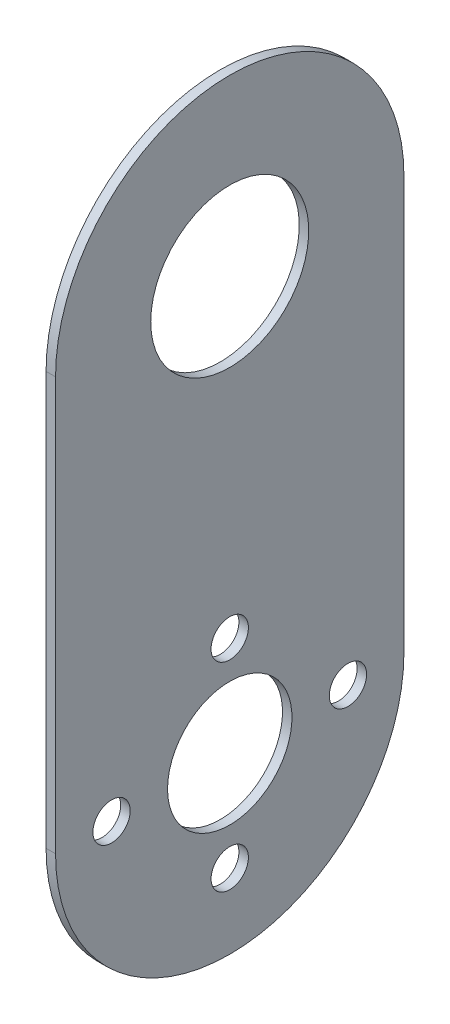
ISO-10303-21;
HEADER;
FILE_DESCRIPTION(('STEP AP214'),'2;1');
FILE_NAME('part.step','',(''),(''),'','','');
FILE_SCHEMA(('AUTOMOTIVE_DESIGN { 1 0 10303 214 1 1 1 1 }'));
ENDSEC;
DATA;
#1=APPLICATION_CONTEXT('core data for automotive mechanical design processes');
#2=APPLICATION_PROTOCOL_DEFINITION('international standard','automotive_design',2000,#1);
#3=PRODUCT_CONTEXT('',#1,'mechanical');
#4=PRODUCT('Part','Part','',(#3));
#5=PRODUCT_RELATED_PRODUCT_CATEGORY('part','',(#4));
#6=PRODUCT_DEFINITION_FORMATION('','',#4);
#7=PRODUCT_DEFINITION_CONTEXT('part definition',#1,'design');
#8=PRODUCT_DEFINITION('design','',#6,#7);
#9=PRODUCT_DEFINITION_SHAPE('','',#8);
#10=(LENGTH_UNIT() NAMED_UNIT(*) SI_UNIT(.MILLI.,.METRE.));
#11=(NAMED_UNIT(*) PLANE_ANGLE_UNIT() SI_UNIT($,.RADIAN.));
#12=(NAMED_UNIT(*) SI_UNIT($,.STERADIAN.) SOLID_ANGLE_UNIT());
#13=UNCERTAINTY_MEASURE_WITH_UNIT(LENGTH_MEASURE(1.E-05),#10,'distance_accuracy_value','');
#14=(GEOMETRIC_REPRESENTATION_CONTEXT(3) GLOBAL_UNCERTAINTY_ASSIGNED_CONTEXT((#13)) GLOBAL_UNIT_ASSIGNED_CONTEXT((#10,
#11,#12)) REPRESENTATION_CONTEXT('',''));
#15=CARTESIAN_POINT('',(0.,0.,0.));
#16=DIRECTION('',(0.,0.,1.));
#17=DIRECTION('',(1.,0.,0.));
#18=AXIS2_PLACEMENT_3D('',#15,#16,#17);
#19=CARTESIAN_POINT('',(0.762,0.,-14.00048));
#20=DIRECTION('',(0.,0.,-1.));
#21=DIRECTION('',(0.,1.,0.));
#22=AXIS2_PLACEMENT_3D('',#19,#20,#21);
#23=PLANE('',#22);
#24=DIRECTION('',(0.,-1.,0.));
#25=VECTOR('',#24,1.);
#26=CARTESIAN_POINT('',(0.,0.,-14.00048));
#27=LINE('',#26,#25);
#28=CARTESIAN_POINT('',(0.,0.,-14.00048));
#29=VERTEX_POINT('',#28);
#30=CARTESIAN_POINT('',(0.,-33.1978,-14.00048));
#31=VERTEX_POINT('',#30);
#32=EDGE_CURVE('E106',#29,#31,#27,.T.);
#33=ORIENTED_EDGE('',*,*,#32,.F.);
#34=DIRECTION('',(-1.,0.,0.));
#35=VECTOR('',#34,1.);
#36=CARTESIAN_POINT('',(0.762,0.,-14.00048));
#37=LINE('',#36,#35);
#38=CARTESIAN_POINT('',(0.762,0.,-14.00048));
#39=VERTEX_POINT('',#38);
#40=EDGE_CURVE('E11',#39,#29,#37,.T.);
#41=ORIENTED_EDGE('',*,*,#40,.F.);
#42=DIRECTION('',(0.,-1.,0.));
#43=VECTOR('',#42,1.);
#44=CARTESIAN_POINT('',(0.762,0.,-14.00048));
#45=LINE('',#44,#43);
#46=CARTESIAN_POINT('',(0.762,-33.1978,-14.00048));
#47=VERTEX_POINT('',#46);
#48=EDGE_CURVE('E92',#39,#47,#45,.T.);
#49=ORIENTED_EDGE('',*,*,#48,.T.);
#50=DIRECTION('',(-1.,0.,0.));
#51=VECTOR('',#50,1.);
#52=CARTESIAN_POINT('',(0.762,-33.1978,-14.00048));
#53=LINE('',#52,#51);
#54=EDGE_CURVE('E74',#47,#31,#53,.T.);
#55=ORIENTED_EDGE('',*,*,#54,.T.);
#56=EDGE_LOOP('',(#33,#41,#49,#55));
#57=FACE_BOUND('',#56,.T.);
#58=ADVANCED_FACE('F35',(#57),#23,.T.);
#59=CARTESIAN_POINT('',(0.762,0.,0.));
#60=DIRECTION('',(-1.,0.,0.));
#61=DIRECTION('',(0.,0.,1.));
#62=AXIS2_PLACEMENT_3D('',#59,#60,#61);
#63=CYLINDRICAL_SURFACE('',#62,14.00048);
#64=CARTESIAN_POINT('',(0.,0.,0.));
#65=DIRECTION('',(1.,0.,0.));
#66=DIRECTION('',(0.,0.,-1.));
#67=AXIS2_PLACEMENT_3D('',#64,#65,#66);
#68=CIRCLE('',#67,14.00048);
#69=CARTESIAN_POINT('',(0.,0.,14.00048));
#70=VERTEX_POINT('',#69);
#71=EDGE_CURVE('E97',#29,#70,#68,.T.);
#72=ORIENTED_EDGE('',*,*,#71,.T.);
#73=DIRECTION('',(-1.,0.,0.));
#74=VECTOR('',#73,1.);
#75=CARTESIAN_POINT('',(0.762,0.,14.00048));
#76=LINE('',#75,#74);
#77=CARTESIAN_POINT('',(0.762,0.,14.00048));
#78=VERTEX_POINT('',#77);
#79=EDGE_CURVE('E44',#78,#70,#76,.T.);
#80=ORIENTED_EDGE('',*,*,#79,.F.);
#81=CARTESIAN_POINT('',(0.762,0.,0.));
#82=DIRECTION('',(1.,0.,0.));
#83=DIRECTION('',(0.,0.,-1.));
#84=AXIS2_PLACEMENT_3D('',#81,#82,#83);
#85=CIRCLE('',#84,14.00048);
#86=EDGE_CURVE('E89',#39,#78,#85,.T.);
#87=ORIENTED_EDGE('',*,*,#86,.F.);
#88=ORIENTED_EDGE('',*,*,#40,.T.);
#89=EDGE_LOOP('',(#72,#80,#87,#88));
#90=FACE_BOUND('',#89,.T.);
#91=ADVANCED_FACE('F95',(#90),#63,.T.);
#92=CARTESIAN_POINT('',(0.762,0.,14.00048));
#93=DIRECTION('',(0.,0.,-1.));
#94=DIRECTION('',(0.,1.,0.));
#95=AXIS2_PLACEMENT_3D('',#92,#93,#94);
#96=PLANE('',#95);
#97=DIRECTION('',(0.,-1.,0.));
#98=VECTOR('',#97,1.);
#99=CARTESIAN_POINT('',(0.,0.,14.00048));
#100=LINE('',#99,#98);
#101=CARTESIAN_POINT('',(0.,-33.1978,14.00048));
#102=VERTEX_POINT('',#101);
#103=EDGE_CURVE('E103',#70,#102,#100,.T.);
#104=ORIENTED_EDGE('',*,*,#103,.T.);
#105=DIRECTION('',(-1.,0.,0.));
#106=VECTOR('',#105,1.);
#107=CARTESIAN_POINT('',(0.762,-33.1978,14.00048));
#108=LINE('',#107,#106);
#109=CARTESIAN_POINT('',(0.762,-33.1978,14.00048));
#110=VERTEX_POINT('',#109);
#111=EDGE_CURVE('E88',#110,#102,#108,.T.);
#112=ORIENTED_EDGE('',*,*,#111,.F.);
#113=DIRECTION('',(0.,-1.,0.));
#114=VECTOR('',#113,1.);
#115=CARTESIAN_POINT('',(0.762,0.,14.00048));
#116=LINE('',#115,#114);
#117=EDGE_CURVE('E82',#78,#110,#116,.T.);
#118=ORIENTED_EDGE('',*,*,#117,.F.);
#119=ORIENTED_EDGE('',*,*,#79,.T.);
#120=EDGE_LOOP('',(#104,#112,#118,#119));
#121=FACE_BOUND('',#120,.T.);
#122=ADVANCED_FACE('F85',(#121),#96,.F.);
#123=CARTESIAN_POINT('',(0.762,0.,0.));
#124=DIRECTION('',(-1.,0.,0.));
#125=DIRECTION('',(0.,0.,1.));
#126=AXIS2_PLACEMENT_3D('',#123,#124,#125);
#127=CYLINDRICAL_SURFACE('',#126,6.35);
#128=CARTESIAN_POINT('',(0.762,0.,0.));
#129=DIRECTION('',(1.,0.,0.));
#130=DIRECTION('',(0.,0.,-1.));
#131=AXIS2_PLACEMENT_3D('',#128,#129,#130);
#132=CIRCLE('',#131,6.35);
#133=CARTESIAN_POINT('',(0.762,0.,6.35));
#134=VERTEX_POINT('',#133);
#135=EDGE_CURVE('E128',#134,#134,#132,.T.);
#136=CARTESIAN_POINT('',(0.,0.,0.));
#137=DIRECTION('',(1.,0.,0.));
#138=DIRECTION('',(0.,0.,-1.));
#139=AXIS2_PLACEMENT_3D('',#136,#137,#138);
#140=CIRCLE('',#139,6.35);
#141=CARTESIAN_POINT('',(0.,0.,6.35));
#142=VERTEX_POINT('',#141);
#143=EDGE_CURVE('E108',#142,#142,#140,.T.);
#144=CARTESIAN_POINT('',(0.762,0.,6.35));
#145=CARTESIAN_POINT('',(0.7540625,0.,6.35));
#146=CARTESIAN_POINT('',(0.746125,0.,6.35));
#147=CARTESIAN_POINT('',(0.73025,0.,6.35));
#148=CARTESIAN_POINT('',(0.7223125,0.,6.35));
#149=CARTESIAN_POINT('',(0.7064375,0.,6.35));
#150=CARTESIAN_POINT('',(0.6985,0.,6.35));
#151=CARTESIAN_POINT('',(0.682625,0.,6.35));
#152=CARTESIAN_POINT('',(0.6746875,0.,6.35));
#153=CARTESIAN_POINT('',(0.6588125,0.,6.35));
#154=CARTESIAN_POINT('',(0.650875,0.,6.35));
#155=CARTESIAN_POINT('',(0.635,0.,6.35));
#156=CARTESIAN_POINT('',(0.6270625,0.,6.35));
#157=CARTESIAN_POINT('',(0.6111875,0.,6.35));
#158=CARTESIAN_POINT('',(0.60325,0.,6.35));
#159=CARTESIAN_POINT('',(0.587375,0.,6.35));
#160=CARTESIAN_POINT('',(0.5794375,0.,6.35));
#161=CARTESIAN_POINT('',(0.5635625,0.,6.35));
#162=CARTESIAN_POINT('',(0.555625,0.,6.35));
#163=CARTESIAN_POINT('',(0.53975,0.,6.35));
#164=CARTESIAN_POINT('',(0.5318125,0.,6.35));
#165=CARTESIAN_POINT('',(0.5159375,0.,6.35));
#166=CARTESIAN_POINT('',(0.508,0.,6.35));
#167=CARTESIAN_POINT('',(0.492125,0.,6.35));
#168=CARTESIAN_POINT('',(0.4841875,0.,6.35));
#169=CARTESIAN_POINT('',(0.4683125,0.,6.35));
#170=CARTESIAN_POINT('',(0.460375,0.,6.35));
#171=CARTESIAN_POINT('',(0.4445,0.,6.35));
#172=CARTESIAN_POINT('',(0.4365625,0.,6.35));
#173=CARTESIAN_POINT('',(0.4206875,0.,6.35));
#174=CARTESIAN_POINT('',(0.41275,0.,6.35));
#175=CARTESIAN_POINT('',(0.396875,0.,6.35));
#176=CARTESIAN_POINT('',(0.3889375,0.,6.35));
#177=CARTESIAN_POINT('',(0.3730625,0.,6.35));
#178=CARTESIAN_POINT('',(0.365125,0.,6.35));
#179=CARTESIAN_POINT('',(0.34925,0.,6.35));
#180=CARTESIAN_POINT('',(0.3413125,0.,6.35));
#181=CARTESIAN_POINT('',(0.3254375,0.,6.35));
#182=CARTESIAN_POINT('',(0.3175,0.,6.35));
#183=CARTESIAN_POINT('',(0.301625,0.,6.35));
#184=CARTESIAN_POINT('',(0.2936875,0.,6.35));
#185=CARTESIAN_POINT('',(0.2778125,0.,6.35));
#186=CARTESIAN_POINT('',(0.269875,0.,6.35));
#187=CARTESIAN_POINT('',(0.254,0.,6.35));
#188=CARTESIAN_POINT('',(0.2460625,0.,6.35));
#189=CARTESIAN_POINT('',(0.2301875,0.,6.35));
#190=CARTESIAN_POINT('',(0.22225,0.,6.35));
#191=CARTESIAN_POINT('',(0.206375,0.,6.35));
#192=CARTESIAN_POINT('',(0.1984375,0.,6.35));
#193=CARTESIAN_POINT('',(0.1825625,0.,6.35));
#194=CARTESIAN_POINT('',(0.174625,0.,6.35));
#195=CARTESIAN_POINT('',(0.15875,0.,6.35));
#196=CARTESIAN_POINT('',(0.1508125,0.,6.35));
#197=CARTESIAN_POINT('',(0.1349375,0.,6.35));
#198=CARTESIAN_POINT('',(0.127,0.,6.35));
#199=CARTESIAN_POINT('',(0.111125,0.,6.35));
#200=CARTESIAN_POINT('',(0.1031875,0.,6.35));
#201=CARTESIAN_POINT('',(0.0873125,0.,6.35));
#202=CARTESIAN_POINT('',(0.079375,0.,6.35));
#203=CARTESIAN_POINT('',(0.0635,0.,6.35));
#204=CARTESIAN_POINT('',(0.0555625,0.,6.35));
#205=CARTESIAN_POINT('',(0.0396875,0.,6.35));
#206=CARTESIAN_POINT('',(0.03175,0.,6.35));
#207=CARTESIAN_POINT('',(0.015875,0.,6.35));
#208=CARTESIAN_POINT('',(0.00793749999999999,0.,6.35));
#209=CARTESIAN_POINT('',(0.,0.,6.35));
#210=B_SPLINE_CURVE_WITH_KNOTS('',3,(#144,#145,#146,#147,#148,#149,#150,#151,#152,#153,#154,
#155,#156,#157,#158,#159,#160,#161,#162,#163,#164,#165,#166,#167,#168,#169,#170,#171,#172,#173,
#174,#175,#176,#177,#178,#179,#180,#181,#182,#183,#184,#185,#186,#187,#188,#189,#190,#191,#192,
#193,#194,#195,#196,#197,#198,#199,#200,#201,#202,#203,#204,#205,#206,#207,#208,#209),
.UNSPECIFIED.,.F.,.F.,(4,2,2,2,2,2,2,2,2,2,2,2,2,2,2,2,2,2,2,2,2,2,2,2,2,2,2,2,2,2,2,2,4),(0.,
0.0238125000000001,0.047625,0.0714375,0.0952500000000001,0.1190625,0.142875,0.1666875,0.1905,
0.2143125,0.238125,0.2619375,0.28575,0.3095625,0.333375,0.3571875,0.381,0.4048125,0.428625,
0.4524375,0.47625,0.5000625,0.523875,0.5476875,0.5715,0.5953125,0.619125,0.6429375,0.66675,
0.6905625,0.714375,0.7381875,0.762),.UNSPECIFIED.);
#211=EDGE_CURVE('BSEAM163',#134,#142,#210,.T.);
#212=ORIENTED_EDGE('',*,*,#135,.T.);
#213=ORIENTED_EDGE('',*,*,#143,.F.);
#214=ORIENTED_EDGE('',*,*,#211,.T.);
#215=ORIENTED_EDGE('',*,*,#211,.F.);
#216=EDGE_LOOP('',(#212,#214,#213,#215));
#217=FACE_BOUND('',#216,.T.);
#218=ADVANCED_FACE('F163',(#217),#127,.F.);
#219=CARTESIAN_POINT('',(0.762,-25.1978,0.));
#220=DIRECTION('',(-1.,0.,0.));
#221=DIRECTION('',(0.,0.,1.));
#222=AXIS2_PLACEMENT_3D('',#219,#220,#221);
#223=CYLINDRICAL_SURFACE('',#222,1.5);
#224=CARTESIAN_POINT('',(0.762,-25.1978,0.));
#225=DIRECTION('',(1.,0.,0.));
#226=DIRECTION('',(0.,0.,-1.));
#227=AXIS2_PLACEMENT_3D('',#224,#225,#226);
#228=CIRCLE('',#227,1.5);
#229=CARTESIAN_POINT('',(0.762,-25.1978,1.5));
#230=VERTEX_POINT('',#229);
#231=EDGE_CURVE('E131',#230,#230,#228,.T.);
#232=CARTESIAN_POINT('',(0.,-25.1978,0.));
#233=DIRECTION('',(1.,0.,0.));
#234=DIRECTION('',(0.,0.,-1.));
#235=AXIS2_PLACEMENT_3D('',#232,#233,#234);
#236=CIRCLE('',#235,1.5);
#237=CARTESIAN_POINT('',(0.,-25.1978,1.5));
#238=VERTEX_POINT('',#237);
#239=EDGE_CURVE('E111',#238,#238,#236,.T.);
#240=CARTESIAN_POINT('',(0.762,-25.1978,1.5));
#241=CARTESIAN_POINT('',(0.7540625,-25.1978,1.5));
#242=CARTESIAN_POINT('',(0.746125,-25.1978,1.5));
#243=CARTESIAN_POINT('',(0.73025,-25.1978,1.5));
#244=CARTESIAN_POINT('',(0.7223125,-25.1978,1.5));
#245=CARTESIAN_POINT('',(0.7064375,-25.1978,1.5));
#246=CARTESIAN_POINT('',(0.6985,-25.1978,1.5));
#247=CARTESIAN_POINT('',(0.682625,-25.1978,1.5));
#248=CARTESIAN_POINT('',(0.6746875,-25.1978,1.5));
#249=CARTESIAN_POINT('',(0.6588125,-25.1978,1.5));
#250=CARTESIAN_POINT('',(0.650875,-25.1978,1.5));
#251=CARTESIAN_POINT('',(0.635,-25.1978,1.5));
#252=CARTESIAN_POINT('',(0.6270625,-25.1978,1.5));
#253=CARTESIAN_POINT('',(0.6111875,-25.1978,1.5));
#254=CARTESIAN_POINT('',(0.60325,-25.1978,1.5));
#255=CARTESIAN_POINT('',(0.587375,-25.1978,1.5));
#256=CARTESIAN_POINT('',(0.5794375,-25.1978,1.5));
#257=CARTESIAN_POINT('',(0.5635625,-25.1978,1.5));
#258=CARTESIAN_POINT('',(0.555625,-25.1978,1.5));
#259=CARTESIAN_POINT('',(0.53975,-25.1978,1.5));
#260=CARTESIAN_POINT('',(0.5318125,-25.1978,1.5));
#261=CARTESIAN_POINT('',(0.5159375,-25.1978,1.5));
#262=CARTESIAN_POINT('',(0.508,-25.1978,1.5));
#263=CARTESIAN_POINT('',(0.492125,-25.1978,1.5));
#264=CARTESIAN_POINT('',(0.4841875,-25.1978,1.5));
#265=CARTESIAN_POINT('',(0.4683125,-25.1978,1.5));
#266=CARTESIAN_POINT('',(0.460375,-25.1978,1.5));
#267=CARTESIAN_POINT('',(0.4445,-25.1978,1.5));
#268=CARTESIAN_POINT('',(0.4365625,-25.1978,1.5));
#269=CARTESIAN_POINT('',(0.4206875,-25.1978,1.5));
#270=CARTESIAN_POINT('',(0.41275,-25.1978,1.5));
#271=CARTESIAN_POINT('',(0.396875,-25.1978,1.5));
#272=CARTESIAN_POINT('',(0.3889375,-25.1978,1.5));
#273=CARTESIAN_POINT('',(0.3730625,-25.1978,1.5));
#274=CARTESIAN_POINT('',(0.365125,-25.1978,1.5));
#275=CARTESIAN_POINT('',(0.34925,-25.1978,1.5));
#276=CARTESIAN_POINT('',(0.3413125,-25.1978,1.5));
#277=CARTESIAN_POINT('',(0.3254375,-25.1978,1.5));
#278=CARTESIAN_POINT('',(0.3175,-25.1978,1.5));
#279=CARTESIAN_POINT('',(0.301625,-25.1978,1.5));
#280=CARTESIAN_POINT('',(0.2936875,-25.1978,1.5));
#281=CARTESIAN_POINT('',(0.2778125,-25.1978,1.5));
#282=CARTESIAN_POINT('',(0.269875,-25.1978,1.5));
#283=CARTESIAN_POINT('',(0.254,-25.1978,1.5));
#284=CARTESIAN_POINT('',(0.2460625,-25.1978,1.5));
#285=CARTESIAN_POINT('',(0.2301875,-25.1978,1.5));
#286=CARTESIAN_POINT('',(0.22225,-25.1978,1.5));
#287=CARTESIAN_POINT('',(0.206375,-25.1978,1.5));
#288=CARTESIAN_POINT('',(0.1984375,-25.1978,1.5));
#289=CARTESIAN_POINT('',(0.1825625,-25.1978,1.5));
#290=CARTESIAN_POINT('',(0.174625,-25.1978,1.5));
#291=CARTESIAN_POINT('',(0.15875,-25.1978,1.5));
#292=CARTESIAN_POINT('',(0.1508125,-25.1978,1.5));
#293=CARTESIAN_POINT('',(0.1349375,-25.1978,1.5));
#294=CARTESIAN_POINT('',(0.127,-25.1978,1.5));
#295=CARTESIAN_POINT('',(0.111125,-25.1978,1.5));
#296=CARTESIAN_POINT('',(0.1031875,-25.1978,1.5));
#297=CARTESIAN_POINT('',(0.0873125,-25.1978,1.5));
#298=CARTESIAN_POINT('',(0.079375,-25.1978,1.5));
#299=CARTESIAN_POINT('',(0.0635,-25.1978,1.5));
#300=CARTESIAN_POINT('',(0.0555625,-25.1978,1.5));
#301=CARTESIAN_POINT('',(0.0396875,-25.1978,1.5));
#302=CARTESIAN_POINT('',(0.03175,-25.1978,1.5));
#303=CARTESIAN_POINT('',(0.015875,-25.1978,1.5));
#304=CARTESIAN_POINT('',(0.00793749999999999,-25.1978,1.5));
#305=CARTESIAN_POINT('',(0.,-25.1978,1.5));
#306=B_SPLINE_CURVE_WITH_KNOTS('',3,(#240,#241,#242,#243,#244,#245,#246,#247,#248,#249,#250,
#251,#252,#253,#254,#255,#256,#257,#258,#259,#260,#261,#262,#263,#264,#265,#266,#267,#268,#269,
#270,#271,#272,#273,#274,#275,#276,#277,#278,#279,#280,#281,#282,#283,#284,#285,#286,#287,#288,
#289,#290,#291,#292,#293,#294,#295,#296,#297,#298,#299,#300,#301,#302,#303,#304,#305),
.UNSPECIFIED.,.F.,.F.,(4,2,2,2,2,2,2,2,2,2,2,2,2,2,2,2,2,2,2,2,2,2,2,2,2,2,2,2,2,2,2,2,4),(0.,
0.0238125000000001,0.047625,0.0714375,0.0952500000000001,0.1190625,0.142875,0.1666875,0.1905,
0.2143125,0.238125,0.2619375,0.28575,0.3095625,0.333375,0.3571875,0.381,0.4048125,0.428625,
0.4524375,0.47625,0.5000625,0.523875,0.5476875,0.5715,0.5953125,0.619125,0.6429375,0.66675,
0.6905625,0.714375,0.7381875,0.762),.UNSPECIFIED.);
#307=EDGE_CURVE('BSEAM166',#230,#238,#306,.T.);
#308=ORIENTED_EDGE('',*,*,#231,.T.);
#309=ORIENTED_EDGE('',*,*,#239,.F.);
#310=ORIENTED_EDGE('',*,*,#307,.T.);
#311=ORIENTED_EDGE('',*,*,#307,.F.);
#312=EDGE_LOOP('',(#308,#310,#309,#311));
#313=FACE_BOUND('',#312,.T.);
#314=ADVANCED_FACE('F166',(#313),#223,.F.);
#315=CARTESIAN_POINT('',(0.762,-41.1978,0.));
#316=DIRECTION('',(-1.,0.,0.));
#317=DIRECTION('',(0.,0.,1.));
#318=AXIS2_PLACEMENT_3D('',#315,#316,#317);
#319=CYLINDRICAL_SURFACE('',#318,1.5);
#320=CARTESIAN_POINT('',(0.762,-41.1978,0.));
#321=DIRECTION('',(1.,0.,0.));
#322=DIRECTION('',(0.,0.,-1.));
#323=AXIS2_PLACEMENT_3D('',#320,#321,#322);
#324=CIRCLE('',#323,1.5);
#325=CARTESIAN_POINT('',(0.762,-41.1978,1.5));
#326=VERTEX_POINT('',#325);
#327=EDGE_CURVE('E134',#326,#326,#324,.T.);
#328=CARTESIAN_POINT('',(0.,-41.1978,0.));
#329=DIRECTION('',(1.,0.,0.));
#330=DIRECTION('',(0.,0.,-1.));
#331=AXIS2_PLACEMENT_3D('',#328,#329,#330);
#332=CIRCLE('',#331,1.5);
#333=CARTESIAN_POINT('',(0.,-41.1978,1.5));
#334=VERTEX_POINT('',#333);
#335=EDGE_CURVE('E114',#334,#334,#332,.T.);
#336=CARTESIAN_POINT('',(0.762,-41.1978,1.5));
#337=CARTESIAN_POINT('',(0.7540625,-41.1978,1.5));
#338=CARTESIAN_POINT('',(0.746125,-41.1978,1.5));
#339=CARTESIAN_POINT('',(0.73025,-41.1978,1.5));
#340=CARTESIAN_POINT('',(0.7223125,-41.1978,1.5));
#341=CARTESIAN_POINT('',(0.7064375,-41.1978,1.5));
#342=CARTESIAN_POINT('',(0.6985,-41.1978,1.5));
#343=CARTESIAN_POINT('',(0.682625,-41.1978,1.5));
#344=CARTESIAN_POINT('',(0.6746875,-41.1978,1.5));
#345=CARTESIAN_POINT('',(0.6588125,-41.1978,1.5));
#346=CARTESIAN_POINT('',(0.650875,-41.1978,1.5));
#347=CARTESIAN_POINT('',(0.635,-41.1978,1.5));
#348=CARTESIAN_POINT('',(0.6270625,-41.1978,1.5));
#349=CARTESIAN_POINT('',(0.6111875,-41.1978,1.5));
#350=CARTESIAN_POINT('',(0.60325,-41.1978,1.5));
#351=CARTESIAN_POINT('',(0.587375,-41.1978,1.5));
#352=CARTESIAN_POINT('',(0.5794375,-41.1978,1.5));
#353=CARTESIAN_POINT('',(0.5635625,-41.1978,1.5));
#354=CARTESIAN_POINT('',(0.555625,-41.1978,1.5));
#355=CARTESIAN_POINT('',(0.53975,-41.1978,1.5));
#356=CARTESIAN_POINT('',(0.5318125,-41.1978,1.5));
#357=CARTESIAN_POINT('',(0.5159375,-41.1978,1.5));
#358=CARTESIAN_POINT('',(0.508,-41.1978,1.5));
#359=CARTESIAN_POINT('',(0.492125,-41.1978,1.5));
#360=CARTESIAN_POINT('',(0.4841875,-41.1978,1.5));
#361=CARTESIAN_POINT('',(0.4683125,-41.1978,1.5));
#362=CARTESIAN_POINT('',(0.460375,-41.1978,1.5));
#363=CARTESIAN_POINT('',(0.4445,-41.1978,1.5));
#364=CARTESIAN_POINT('',(0.4365625,-41.1978,1.5));
#365=CARTESIAN_POINT('',(0.4206875,-41.1978,1.5));
#366=CARTESIAN_POINT('',(0.41275,-41.1978,1.5));
#367=CARTESIAN_POINT('',(0.396875,-41.1978,1.5));
#368=CARTESIAN_POINT('',(0.3889375,-41.1978,1.5));
#369=CARTESIAN_POINT('',(0.3730625,-41.1978,1.5));
#370=CARTESIAN_POINT('',(0.365125,-41.1978,1.5));
#371=CARTESIAN_POINT('',(0.34925,-41.1978,1.5));
#372=CARTESIAN_POINT('',(0.3413125,-41.1978,1.5));
#373=CARTESIAN_POINT('',(0.3254375,-41.1978,1.5));
#374=CARTESIAN_POINT('',(0.3175,-41.1978,1.5));
#375=CARTESIAN_POINT('',(0.301625,-41.1978,1.5));
#376=CARTESIAN_POINT('',(0.2936875,-41.1978,1.5));
#377=CARTESIAN_POINT('',(0.2778125,-41.1978,1.5));
#378=CARTESIAN_POINT('',(0.269875,-41.1978,1.5));
#379=CARTESIAN_POINT('',(0.254,-41.1978,1.5));
#380=CARTESIAN_POINT('',(0.2460625,-41.1978,1.5));
#381=CARTESIAN_POINT('',(0.2301875,-41.1978,1.5));
#382=CARTESIAN_POINT('',(0.22225,-41.1978,1.5));
#383=CARTESIAN_POINT('',(0.206375,-41.1978,1.5));
#384=CARTESIAN_POINT('',(0.1984375,-41.1978,1.5));
#385=CARTESIAN_POINT('',(0.1825625,-41.1978,1.5));
#386=CARTESIAN_POINT('',(0.174625,-41.1978,1.5));
#387=CARTESIAN_POINT('',(0.15875,-41.1978,1.5));
#388=CARTESIAN_POINT('',(0.1508125,-41.1978,1.5));
#389=CARTESIAN_POINT('',(0.1349375,-41.1978,1.5));
#390=CARTESIAN_POINT('',(0.127,-41.1978,1.5));
#391=CARTESIAN_POINT('',(0.111125,-41.1978,1.5));
#392=CARTESIAN_POINT('',(0.1031875,-41.1978,1.5));
#393=CARTESIAN_POINT('',(0.0873125,-41.1978,1.5));
#394=CARTESIAN_POINT('',(0.079375,-41.1978,1.5));
#395=CARTESIAN_POINT('',(0.0635,-41.1978,1.5));
#396=CARTESIAN_POINT('',(0.0555625,-41.1978,1.5));
#397=CARTESIAN_POINT('',(0.0396875,-41.1978,1.5));
#398=CARTESIAN_POINT('',(0.03175,-41.1978,1.5));
#399=CARTESIAN_POINT('',(0.015875,-41.1978,1.5));
#400=CARTESIAN_POINT('',(0.00793749999999999,-41.1978,1.5));
#401=CARTESIAN_POINT('',(0.,-41.1978,1.5));
#402=B_SPLINE_CURVE_WITH_KNOTS('',3,(#336,#337,#338,#339,#340,#341,#342,#343,#344,#345,#346,
#347,#348,#349,#350,#351,#352,#353,#354,#355,#356,#357,#358,#359,#360,#361,#362,#363,#364,#365,
#366,#367,#368,#369,#370,#371,#372,#373,#374,#375,#376,#377,#378,#379,#380,#381,#382,#383,#384,
#385,#386,#387,#388,#389,#390,#391,#392,#393,#394,#395,#396,#397,#398,#399,#400,#401),
.UNSPECIFIED.,.F.,.F.,(4,2,2,2,2,2,2,2,2,2,2,2,2,2,2,2,2,2,2,2,2,2,2,2,2,2,2,2,2,2,2,2,4),(0.,
0.0238125000000001,0.047625,0.0714375,0.0952500000000001,0.1190625,0.142875,0.1666875,0.1905,
0.2143125,0.238125,0.2619375,0.28575,0.3095625,0.333375,0.3571875,0.381,0.4048125,0.428625,
0.4524375,0.47625,0.5000625,0.523875,0.5476875,0.5715,0.5953125,0.619125,0.6429375,0.66675,
0.6905625,0.714375,0.7381875,0.762),.UNSPECIFIED.);
#403=EDGE_CURVE('BSEAM183',#326,#334,#402,.T.);
#404=ORIENTED_EDGE('',*,*,#327,.T.);
#405=ORIENTED_EDGE('',*,*,#335,.F.);
#406=ORIENTED_EDGE('',*,*,#403,.T.);
#407=ORIENTED_EDGE('',*,*,#403,.F.);
#408=EDGE_LOOP('',(#404,#406,#405,#407));
#409=FACE_BOUND('',#408,.T.);
#410=ADVANCED_FACE('F183',(#409),#319,.F.);
#411=CARTESIAN_POINT('',(0.762,-33.1978,9.5));
#412=DIRECTION('',(-1.,0.,0.));
#413=DIRECTION('',(0.,0.,1.));
#414=AXIS2_PLACEMENT_3D('',#411,#412,#413);
#415=CYLINDRICAL_SURFACE('',#414,1.5);
#416=CARTESIAN_POINT('',(0.762,-33.1978,9.5));
#417=DIRECTION('',(1.,0.,0.));
#418=DIRECTION('',(0.,0.,-1.));
#419=AXIS2_PLACEMENT_3D('',#416,#417,#418);
#420=CIRCLE('',#419,1.5);
#421=CARTESIAN_POINT('',(0.762,-33.1978,11.));
#422=VERTEX_POINT('',#421);
#423=EDGE_CURVE('E137',#422,#422,#420,.T.);
#424=CARTESIAN_POINT('',(0.,-33.1978,9.5));
#425=DIRECTION('',(1.,0.,0.));
#426=DIRECTION('',(0.,0.,-1.));
#427=AXIS2_PLACEMENT_3D('',#424,#425,#426);
#428=CIRCLE('',#427,1.5);
#429=CARTESIAN_POINT('',(0.,-33.1978,11.));
#430=VERTEX_POINT('',#429);
#431=EDGE_CURVE('E117',#430,#430,#428,.T.);
#432=CARTESIAN_POINT('',(0.762,-33.1978,11.));
#433=CARTESIAN_POINT('',(0.7540625,-33.1978,11.));
#434=CARTESIAN_POINT('',(0.746125,-33.1978,11.));
#435=CARTESIAN_POINT('',(0.73025,-33.1978,11.));
#436=CARTESIAN_POINT('',(0.7223125,-33.1978,11.));
#437=CARTESIAN_POINT('',(0.7064375,-33.1978,11.));
#438=CARTESIAN_POINT('',(0.6985,-33.1978,11.));
#439=CARTESIAN_POINT('',(0.682625,-33.1978,11.));
#440=CARTESIAN_POINT('',(0.6746875,-33.1978,11.));
#441=CARTESIAN_POINT('',(0.6588125,-33.1978,11.));
#442=CARTESIAN_POINT('',(0.650875,-33.1978,11.));
#443=CARTESIAN_POINT('',(0.635,-33.1978,11.));
#444=CARTESIAN_POINT('',(0.6270625,-33.1978,11.));
#445=CARTESIAN_POINT('',(0.6111875,-33.1978,11.));
#446=CARTESIAN_POINT('',(0.60325,-33.1978,11.));
#447=CARTESIAN_POINT('',(0.587375,-33.1978,11.));
#448=CARTESIAN_POINT('',(0.5794375,-33.1978,11.));
#449=CARTESIAN_POINT('',(0.5635625,-33.1978,11.));
#450=CARTESIAN_POINT('',(0.555625,-33.1978,11.));
#451=CARTESIAN_POINT('',(0.53975,-33.1978,11.));
#452=CARTESIAN_POINT('',(0.5318125,-33.1978,11.));
#453=CARTESIAN_POINT('',(0.5159375,-33.1978,11.));
#454=CARTESIAN_POINT('',(0.508,-33.1978,11.));
#455=CARTESIAN_POINT('',(0.492125,-33.1978,11.));
#456=CARTESIAN_POINT('',(0.4841875,-33.1978,11.));
#457=CARTESIAN_POINT('',(0.4683125,-33.1978,11.));
#458=CARTESIAN_POINT('',(0.460375,-33.1978,11.));
#459=CARTESIAN_POINT('',(0.4445,-33.1978,11.));
#460=CARTESIAN_POINT('',(0.4365625,-33.1978,11.));
#461=CARTESIAN_POINT('',(0.4206875,-33.1978,11.));
#462=CARTESIAN_POINT('',(0.41275,-33.1978,11.));
#463=CARTESIAN_POINT('',(0.396875,-33.1978,11.));
#464=CARTESIAN_POINT('',(0.3889375,-33.1978,11.));
#465=CARTESIAN_POINT('',(0.3730625,-33.1978,11.));
#466=CARTESIAN_POINT('',(0.365125,-33.1978,11.));
#467=CARTESIAN_POINT('',(0.34925,-33.1978,11.));
#468=CARTESIAN_POINT('',(0.3413125,-33.1978,11.));
#469=CARTESIAN_POINT('',(0.3254375,-33.1978,11.));
#470=CARTESIAN_POINT('',(0.3175,-33.1978,11.));
#471=CARTESIAN_POINT('',(0.301625,-33.1978,11.));
#472=CARTESIAN_POINT('',(0.2936875,-33.1978,11.));
#473=CARTESIAN_POINT('',(0.2778125,-33.1978,11.));
#474=CARTESIAN_POINT('',(0.269875,-33.1978,11.));
#475=CARTESIAN_POINT('',(0.254,-33.1978,11.));
#476=CARTESIAN_POINT('',(0.2460625,-33.1978,11.));
#477=CARTESIAN_POINT('',(0.2301875,-33.1978,11.));
#478=CARTESIAN_POINT('',(0.22225,-33.1978,11.));
#479=CARTESIAN_POINT('',(0.206375,-33.1978,11.));
#480=CARTESIAN_POINT('',(0.1984375,-33.1978,11.));
#481=CARTESIAN_POINT('',(0.1825625,-33.1978,11.));
#482=CARTESIAN_POINT('',(0.174625,-33.1978,11.));
#483=CARTESIAN_POINT('',(0.15875,-33.1978,11.));
#484=CARTESIAN_POINT('',(0.1508125,-33.1978,11.));
#485=CARTESIAN_POINT('',(0.1349375,-33.1978,11.));
#486=CARTESIAN_POINT('',(0.127,-33.1978,11.));
#487=CARTESIAN_POINT('',(0.111125,-33.1978,11.));
#488=CARTESIAN_POINT('',(0.1031875,-33.1978,11.));
#489=CARTESIAN_POINT('',(0.0873125,-33.1978,11.));
#490=CARTESIAN_POINT('',(0.079375,-33.1978,11.));
#491=CARTESIAN_POINT('',(0.0635,-33.1978,11.));
#492=CARTESIAN_POINT('',(0.0555625,-33.1978,11.));
#493=CARTESIAN_POINT('',(0.0396875,-33.1978,11.));
#494=CARTESIAN_POINT('',(0.03175,-33.1978,11.));
#495=CARTESIAN_POINT('',(0.015875,-33.1978,11.));
#496=CARTESIAN_POINT('',(0.00793749999999999,-33.1978,11.));
#497=CARTESIAN_POINT('',(0.,-33.1978,11.));
#498=B_SPLINE_CURVE_WITH_KNOTS('',3,(#432,#433,#434,#435,#436,#437,#438,#439,#440,#441,#442,
#443,#444,#445,#446,#447,#448,#449,#450,#451,#452,#453,#454,#455,#456,#457,#458,#459,#460,#461,
#462,#463,#464,#465,#466,#467,#468,#469,#470,#471,#472,#473,#474,#475,#476,#477,#478,#479,#480,
#481,#482,#483,#484,#485,#486,#487,#488,#489,#490,#491,#492,#493,#494,#495,#496,#497),
.UNSPECIFIED.,.F.,.F.,(4,2,2,2,2,2,2,2,2,2,2,2,2,2,2,2,2,2,2,2,2,2,2,2,2,2,2,2,2,2,2,2,4),(0.,
0.0238125000000001,0.047625,0.0714375,0.0952500000000001,0.1190625,0.142875,0.1666875,0.1905,
0.2143125,0.238125,0.2619375,0.28575,0.3095625,0.333375,0.3571875,0.381,0.4048125,0.428625,
0.4524375,0.47625,0.5000625,0.523875,0.5476875,0.5715,0.5953125,0.619125,0.6429375,0.66675,
0.6905625,0.714375,0.7381875,0.762),.UNSPECIFIED.);
#499=EDGE_CURVE('BSEAM187',#422,#430,#498,.T.);
#500=ORIENTED_EDGE('',*,*,#423,.T.);
#501=ORIENTED_EDGE('',*,*,#431,.F.);
#502=ORIENTED_EDGE('',*,*,#499,.T.);
#503=ORIENTED_EDGE('',*,*,#499,.F.);
#504=EDGE_LOOP('',(#500,#502,#501,#503));
#505=FACE_BOUND('',#504,.T.);
#506=ADVANCED_FACE('F187',(#505),#415,.F.);
#507=CARTESIAN_POINT('',(0.762,-33.1978,-9.5));
#508=DIRECTION('',(-1.,0.,0.));
#509=DIRECTION('',(0.,0.,1.));
#510=AXIS2_PLACEMENT_3D('',#507,#508,#509);
#511=CYLINDRICAL_SURFACE('',#510,1.5);
#512=CARTESIAN_POINT('',(0.762,-33.1978,-9.5));
#513=DIRECTION('',(1.,0.,0.));
#514=DIRECTION('',(0.,0.,-1.));
#515=AXIS2_PLACEMENT_3D('',#512,#513,#514);
#516=CIRCLE('',#515,1.5);
#517=CARTESIAN_POINT('',(0.762,-33.1978,-8.));
#518=VERTEX_POINT('',#517);
#519=EDGE_CURVE('E140',#518,#518,#516,.T.);
#520=CARTESIAN_POINT('',(0.,-33.1978,-9.5));
#521=DIRECTION('',(1.,0.,0.));
#522=DIRECTION('',(0.,0.,-1.));
#523=AXIS2_PLACEMENT_3D('',#520,#521,#522);
#524=CIRCLE('',#523,1.5);
#525=CARTESIAN_POINT('',(0.,-33.1978,-8.));
#526=VERTEX_POINT('',#525);
#527=EDGE_CURVE('E120',#526,#526,#524,.T.);
#528=CARTESIAN_POINT('',(0.762,-33.1978,-8.));
#529=CARTESIAN_POINT('',(0.7540625,-33.1978,-8.));
#530=CARTESIAN_POINT('',(0.746125,-33.1978,-8.));
#531=CARTESIAN_POINT('',(0.73025,-33.1978,-8.));
#532=CARTESIAN_POINT('',(0.7223125,-33.1978,-8.));
#533=CARTESIAN_POINT('',(0.7064375,-33.1978,-8.));
#534=CARTESIAN_POINT('',(0.6985,-33.1978,-8.));
#535=CARTESIAN_POINT('',(0.682625,-33.1978,-8.));
#536=CARTESIAN_POINT('',(0.6746875,-33.1978,-8.));
#537=CARTESIAN_POINT('',(0.6588125,-33.1978,-8.));
#538=CARTESIAN_POINT('',(0.650875,-33.1978,-8.));
#539=CARTESIAN_POINT('',(0.635,-33.1978,-8.));
#540=CARTESIAN_POINT('',(0.6270625,-33.1978,-8.));
#541=CARTESIAN_POINT('',(0.6111875,-33.1978,-8.));
#542=CARTESIAN_POINT('',(0.60325,-33.1978,-8.));
#543=CARTESIAN_POINT('',(0.587375,-33.1978,-8.));
#544=CARTESIAN_POINT('',(0.5794375,-33.1978,-8.));
#545=CARTESIAN_POINT('',(0.5635625,-33.1978,-8.));
#546=CARTESIAN_POINT('',(0.555625,-33.1978,-8.));
#547=CARTESIAN_POINT('',(0.53975,-33.1978,-8.));
#548=CARTESIAN_POINT('',(0.5318125,-33.1978,-8.));
#549=CARTESIAN_POINT('',(0.5159375,-33.1978,-8.));
#550=CARTESIAN_POINT('',(0.508,-33.1978,-8.));
#551=CARTESIAN_POINT('',(0.492125,-33.1978,-8.));
#552=CARTESIAN_POINT('',(0.4841875,-33.1978,-8.));
#553=CARTESIAN_POINT('',(0.4683125,-33.1978,-8.));
#554=CARTESIAN_POINT('',(0.460375,-33.1978,-8.));
#555=CARTESIAN_POINT('',(0.4445,-33.1978,-8.));
#556=CARTESIAN_POINT('',(0.4365625,-33.1978,-8.));
#557=CARTESIAN_POINT('',(0.4206875,-33.1978,-8.));
#558=CARTESIAN_POINT('',(0.41275,-33.1978,-8.));
#559=CARTESIAN_POINT('',(0.396875,-33.1978,-8.));
#560=CARTESIAN_POINT('',(0.3889375,-33.1978,-8.));
#561=CARTESIAN_POINT('',(0.3730625,-33.1978,-8.));
#562=CARTESIAN_POINT('',(0.365125,-33.1978,-8.));
#563=CARTESIAN_POINT('',(0.34925,-33.1978,-8.));
#564=CARTESIAN_POINT('',(0.3413125,-33.1978,-8.));
#565=CARTESIAN_POINT('',(0.3254375,-33.1978,-8.));
#566=CARTESIAN_POINT('',(0.3175,-33.1978,-8.));
#567=CARTESIAN_POINT('',(0.301625,-33.1978,-8.));
#568=CARTESIAN_POINT('',(0.2936875,-33.1978,-8.));
#569=CARTESIAN_POINT('',(0.2778125,-33.1978,-8.));
#570=CARTESIAN_POINT('',(0.269875,-33.1978,-8.));
#571=CARTESIAN_POINT('',(0.254,-33.1978,-8.));
#572=CARTESIAN_POINT('',(0.2460625,-33.1978,-8.));
#573=CARTESIAN_POINT('',(0.2301875,-33.1978,-8.));
#574=CARTESIAN_POINT('',(0.22225,-33.1978,-8.));
#575=CARTESIAN_POINT('',(0.206375,-33.1978,-8.));
#576=CARTESIAN_POINT('',(0.1984375,-33.1978,-8.));
#577=CARTESIAN_POINT('',(0.1825625,-33.1978,-8.));
#578=CARTESIAN_POINT('',(0.174625,-33.1978,-8.));
#579=CARTESIAN_POINT('',(0.15875,-33.1978,-8.));
#580=CARTESIAN_POINT('',(0.1508125,-33.1978,-8.));
#581=CARTESIAN_POINT('',(0.1349375,-33.1978,-8.));
#582=CARTESIAN_POINT('',(0.127,-33.1978,-8.));
#583=CARTESIAN_POINT('',(0.111125,-33.1978,-8.));
#584=CARTESIAN_POINT('',(0.1031875,-33.1978,-8.));
#585=CARTESIAN_POINT('',(0.0873125,-33.1978,-8.));
#586=CARTESIAN_POINT('',(0.079375,-33.1978,-8.));
#587=CARTESIAN_POINT('',(0.0635,-33.1978,-8.));
#588=CARTESIAN_POINT('',(0.0555625,-33.1978,-8.));
#589=CARTESIAN_POINT('',(0.0396875,-33.1978,-8.));
#590=CARTESIAN_POINT('',(0.03175,-33.1978,-8.));
#591=CARTESIAN_POINT('',(0.015875,-33.1978,-8.));
#592=CARTESIAN_POINT('',(0.00793749999999999,-33.1978,-8.));
#593=CARTESIAN_POINT('',(0.,-33.1978,-8.));
#594=B_SPLINE_CURVE_WITH_KNOTS('',3,(#528,#529,#530,#531,#532,#533,#534,#535,#536,#537,#538,
#539,#540,#541,#542,#543,#544,#545,#546,#547,#548,#549,#550,#551,#552,#553,#554,#555,#556,#557,
#558,#559,#560,#561,#562,#563,#564,#565,#566,#567,#568,#569,#570,#571,#572,#573,#574,#575,#576,
#577,#578,#579,#580,#581,#582,#583,#584,#585,#586,#587,#588,#589,#590,#591,#592,#593),
.UNSPECIFIED.,.F.,.F.,(4,2,2,2,2,2,2,2,2,2,2,2,2,2,2,2,2,2,2,2,2,2,2,2,2,2,2,2,2,2,2,2,4),(0.,
0.0238125000000001,0.047625,0.0714375,0.0952500000000001,0.1190625,0.142875,0.1666875,0.1905,
0.2143125,0.238125,0.2619375,0.28575,0.3095625,0.333375,0.3571875,0.381,0.4048125,0.428625,
0.4524375,0.47625,0.5000625,0.523875,0.5476875,0.5715,0.5953125,0.619125,0.6429375,0.66675,
0.6905625,0.714375,0.7381875,0.762),.UNSPECIFIED.);
#595=EDGE_CURVE('BSEAM190',#518,#526,#594,.T.);
#596=ORIENTED_EDGE('',*,*,#519,.T.);
#597=ORIENTED_EDGE('',*,*,#527,.F.);
#598=ORIENTED_EDGE('',*,*,#595,.T.);
#599=ORIENTED_EDGE('',*,*,#595,.F.);
#600=EDGE_LOOP('',(#596,#598,#597,#599));
#601=FACE_BOUND('',#600,.T.);
#602=ADVANCED_FACE('F190',(#601),#511,.F.);
#603=CARTESIAN_POINT('',(0.762,-33.1978,0.));
#604=DIRECTION('',(-1.,0.,0.));
#605=DIRECTION('',(0.,0.,1.));
#606=AXIS2_PLACEMENT_3D('',#603,#604,#605);
#607=CYLINDRICAL_SURFACE('',#606,5.);
#608=CARTESIAN_POINT('',(0.762,-33.1978,0.));
#609=DIRECTION('',(1.,0.,0.));
#610=DIRECTION('',(0.,0.,-1.));
#611=AXIS2_PLACEMENT_3D('',#608,#609,#610);
#612=CIRCLE('',#611,5.);
#613=CARTESIAN_POINT('',(0.762,-33.1978,5.));
#614=VERTEX_POINT('',#613);
#615=EDGE_CURVE('E102',#614,#614,#612,.T.);
#616=CARTESIAN_POINT('',(0.,-33.1978,0.));
#617=DIRECTION('',(1.,0.,0.));
#618=DIRECTION('',(0.,0.,-1.));
#619=AXIS2_PLACEMENT_3D('',#616,#617,#618);
#620=CIRCLE('',#619,5.);
#621=CARTESIAN_POINT('',(0.,-33.1978,5.));
#622=VERTEX_POINT('',#621);
#623=EDGE_CURVE('E123',#622,#622,#620,.T.);
#624=CARTESIAN_POINT('',(0.762,-33.1978,5.));
#625=CARTESIAN_POINT('',(0.7540625,-33.1978,5.));
#626=CARTESIAN_POINT('',(0.746125,-33.1978,5.));
#627=CARTESIAN_POINT('',(0.73025,-33.1978,5.));
#628=CARTESIAN_POINT('',(0.7223125,-33.1978,5.));
#629=CARTESIAN_POINT('',(0.7064375,-33.1978,5.));
#630=CARTESIAN_POINT('',(0.6985,-33.1978,5.));
#631=CARTESIAN_POINT('',(0.682625,-33.1978,5.));
#632=CARTESIAN_POINT('',(0.6746875,-33.1978,5.));
#633=CARTESIAN_POINT('',(0.6588125,-33.1978,5.));
#634=CARTESIAN_POINT('',(0.650875,-33.1978,5.));
#635=CARTESIAN_POINT('',(0.635,-33.1978,5.));
#636=CARTESIAN_POINT('',(0.6270625,-33.1978,5.));
#637=CARTESIAN_POINT('',(0.6111875,-33.1978,5.));
#638=CARTESIAN_POINT('',(0.60325,-33.1978,5.));
#639=CARTESIAN_POINT('',(0.587375,-33.1978,5.));
#640=CARTESIAN_POINT('',(0.5794375,-33.1978,5.));
#641=CARTESIAN_POINT('',(0.5635625,-33.1978,5.));
#642=CARTESIAN_POINT('',(0.555625,-33.1978,5.));
#643=CARTESIAN_POINT('',(0.53975,-33.1978,5.));
#644=CARTESIAN_POINT('',(0.5318125,-33.1978,5.));
#645=CARTESIAN_POINT('',(0.5159375,-33.1978,5.));
#646=CARTESIAN_POINT('',(0.508,-33.1978,5.));
#647=CARTESIAN_POINT('',(0.492125,-33.1978,5.));
#648=CARTESIAN_POINT('',(0.4841875,-33.1978,5.));
#649=CARTESIAN_POINT('',(0.4683125,-33.1978,5.));
#650=CARTESIAN_POINT('',(0.460375,-33.1978,5.));
#651=CARTESIAN_POINT('',(0.4445,-33.1978,5.));
#652=CARTESIAN_POINT('',(0.4365625,-33.1978,5.));
#653=CARTESIAN_POINT('',(0.4206875,-33.1978,5.));
#654=CARTESIAN_POINT('',(0.41275,-33.1978,5.));
#655=CARTESIAN_POINT('',(0.396875,-33.1978,5.));
#656=CARTESIAN_POINT('',(0.3889375,-33.1978,5.));
#657=CARTESIAN_POINT('',(0.3730625,-33.1978,5.));
#658=CARTESIAN_POINT('',(0.365125,-33.1978,5.));
#659=CARTESIAN_POINT('',(0.34925,-33.1978,5.));
#660=CARTESIAN_POINT('',(0.3413125,-33.1978,5.));
#661=CARTESIAN_POINT('',(0.3254375,-33.1978,5.));
#662=CARTESIAN_POINT('',(0.3175,-33.1978,5.));
#663=CARTESIAN_POINT('',(0.301625,-33.1978,5.));
#664=CARTESIAN_POINT('',(0.2936875,-33.1978,5.));
#665=CARTESIAN_POINT('',(0.2778125,-33.1978,5.));
#666=CARTESIAN_POINT('',(0.269875,-33.1978,5.));
#667=CARTESIAN_POINT('',(0.254,-33.1978,5.));
#668=CARTESIAN_POINT('',(0.2460625,-33.1978,5.));
#669=CARTESIAN_POINT('',(0.2301875,-33.1978,5.));
#670=CARTESIAN_POINT('',(0.22225,-33.1978,5.));
#671=CARTESIAN_POINT('',(0.206375,-33.1978,5.));
#672=CARTESIAN_POINT('',(0.1984375,-33.1978,5.));
#673=CARTESIAN_POINT('',(0.1825625,-33.1978,5.));
#674=CARTESIAN_POINT('',(0.174625,-33.1978,5.));
#675=CARTESIAN_POINT('',(0.15875,-33.1978,5.));
#676=CARTESIAN_POINT('',(0.1508125,-33.1978,5.));
#677=CARTESIAN_POINT('',(0.1349375,-33.1978,5.));
#678=CARTESIAN_POINT('',(0.127,-33.1978,5.));
#679=CARTESIAN_POINT('',(0.111125,-33.1978,5.));
#680=CARTESIAN_POINT('',(0.1031875,-33.1978,5.));
#681=CARTESIAN_POINT('',(0.0873125,-33.1978,5.));
#682=CARTESIAN_POINT('',(0.079375,-33.1978,5.));
#683=CARTESIAN_POINT('',(0.0635,-33.1978,5.));
#684=CARTESIAN_POINT('',(0.0555625,-33.1978,5.));
#685=CARTESIAN_POINT('',(0.0396875,-33.1978,5.));
#686=CARTESIAN_POINT('',(0.03175,-33.1978,5.));
#687=CARTESIAN_POINT('',(0.015875,-33.1978,5.));
#688=CARTESIAN_POINT('',(0.00793749999999999,-33.1978,5.));
#689=CARTESIAN_POINT('',(0.,-33.1978,5.));
#690=B_SPLINE_CURVE_WITH_KNOTS('',3,(#624,#625,#626,#627,#628,#629,#630,#631,#632,#633,#634,
#635,#636,#637,#638,#639,#640,#641,#642,#643,#644,#645,#646,#647,#648,#649,#650,#651,#652,#653,
#654,#655,#656,#657,#658,#659,#660,#661,#662,#663,#664,#665,#666,#667,#668,#669,#670,#671,#672,
#673,#674,#675,#676,#677,#678,#679,#680,#681,#682,#683,#684,#685,#686,#687,#688,#689),
.UNSPECIFIED.,.F.,.F.,(4,2,2,2,2,2,2,2,2,2,2,2,2,2,2,2,2,2,2,2,2,2,2,2,2,2,2,2,2,2,2,2,4),(0.,
0.0238125,0.0476249999999999,0.0714374999999999,0.09525,0.1190625,0.142875,0.1666875,0.1905,
0.2143125,0.238125,0.2619375,0.28575,0.3095625,0.333375,0.3571875,0.381,0.4048125,0.428625,
0.4524375,0.47625,0.5000625,0.523875,0.5476875,0.5715,0.5953125,0.619125,0.6429375,0.66675,
0.6905625,0.714375,0.7381875,0.762),.UNSPECIFIED.);
#691=EDGE_CURVE('BSEAM37',#614,#622,#690,.T.);
#692=ORIENTED_EDGE('',*,*,#615,.T.);
#693=ORIENTED_EDGE('',*,*,#623,.F.);
#694=ORIENTED_EDGE('',*,*,#691,.T.);
#695=ORIENTED_EDGE('',*,*,#691,.F.);
#696=EDGE_LOOP('',(#692,#694,#693,#695));
#697=FACE_BOUND('',#696,.T.);
#698=ADVANCED_FACE('F37',(#697),#607,.F.);
#699=CARTESIAN_POINT('',(0.762,-33.1978,0.));
#700=DIRECTION('',(-1.,0.,0.));
#701=DIRECTION('',(0.,0.,1.));
#702=AXIS2_PLACEMENT_3D('',#699,#700,#701);
#703=CYLINDRICAL_SURFACE('',#702,14.00048);
#704=CARTESIAN_POINT('',(0.,-33.1978,0.));
#705=DIRECTION('',(1.,0.,0.));
#706=DIRECTION('',(0.,0.,-1.));
#707=AXIS2_PLACEMENT_3D('',#704,#705,#706);
#708=CIRCLE('',#707,14.00048);
#709=EDGE_CURVE('E67',#102,#31,#708,.T.);
#710=ORIENTED_EDGE('',*,*,#709,.T.);
#711=ORIENTED_EDGE('',*,*,#54,.F.);
#712=CARTESIAN_POINT('',(0.762,-33.1978,0.));
#713=DIRECTION('',(1.,0.,0.));
#714=DIRECTION('',(0.,0.,-1.));
#715=AXIS2_PLACEMENT_3D('',#712,#713,#714);
#716=CIRCLE('',#715,14.00048);
#717=EDGE_CURVE('E52',#110,#47,#716,.T.);
#718=ORIENTED_EDGE('',*,*,#717,.F.);
#719=ORIENTED_EDGE('',*,*,#111,.T.);
#720=EDGE_LOOP('',(#710,#711,#718,#719));
#721=FACE_BOUND('',#720,.T.);
#722=ADVANCED_FACE('F151',(#721),#703,.T.);
#723=CARTESIAN_POINT('',(0.762,0.,0.));
#724=DIRECTION('',(1.,0.,0.));
#725=DIRECTION('',(0.,0.,-1.));
#726=AXIS2_PLACEMENT_3D('',#723,#724,#725);
#727=PLANE('',#726);
#728=ORIENTED_EDGE('',*,*,#615,.F.);
#729=EDGE_LOOP('',(#728));
#730=FACE_BOUND('',#729,.T.);
#731=ORIENTED_EDGE('',*,*,#519,.F.);
#732=EDGE_LOOP('',(#731));
#733=FACE_BOUND('',#732,.T.);
#734=ORIENTED_EDGE('',*,*,#423,.F.);
#735=EDGE_LOOP('',(#734));
#736=FACE_BOUND('',#735,.T.);
#737=ORIENTED_EDGE('',*,*,#327,.F.);
#738=EDGE_LOOP('',(#737));
#739=FACE_BOUND('',#738,.T.);
#740=ORIENTED_EDGE('',*,*,#231,.F.);
#741=EDGE_LOOP('',(#740));
#742=FACE_BOUND('',#741,.T.);
#743=ORIENTED_EDGE('',*,*,#135,.F.);
#744=EDGE_LOOP('',(#743));
#745=FACE_BOUND('',#744,.T.);
#746=ORIENTED_EDGE('',*,*,#48,.F.);
#747=ORIENTED_EDGE('',*,*,#86,.T.);
#748=ORIENTED_EDGE('',*,*,#117,.T.);
#749=ORIENTED_EDGE('',*,*,#717,.T.);
#750=EDGE_LOOP('',(#746,#747,#748,#749));
#751=FACE_BOUND('',#750,.T.);
#752=ADVANCED_FACE('F91',(#730,#733,#736,#739,#742,#745,#751),#727,.T.);
#753=CARTESIAN_POINT('',(0.,0.,0.));
#754=DIRECTION('',(1.,0.,0.));
#755=DIRECTION('',(0.,0.,-1.));
#756=AXIS2_PLACEMENT_3D('',#753,#754,#755);
#757=PLANE('',#756);
#758=ORIENTED_EDGE('',*,*,#623,.T.);
#759=EDGE_LOOP('',(#758));
#760=FACE_BOUND('',#759,.T.);
#761=ORIENTED_EDGE('',*,*,#527,.T.);
#762=EDGE_LOOP('',(#761));
#763=FACE_BOUND('',#762,.T.);
#764=ORIENTED_EDGE('',*,*,#431,.T.);
#765=EDGE_LOOP('',(#764));
#766=FACE_BOUND('',#765,.T.);
#767=ORIENTED_EDGE('',*,*,#335,.T.);
#768=EDGE_LOOP('',(#767));
#769=FACE_BOUND('',#768,.T.);
#770=ORIENTED_EDGE('',*,*,#239,.T.);
#771=EDGE_LOOP('',(#770));
#772=FACE_BOUND('',#771,.T.);
#773=ORIENTED_EDGE('',*,*,#143,.T.);
#774=EDGE_LOOP('',(#773));
#775=FACE_BOUND('',#774,.T.);
#776=ORIENTED_EDGE('',*,*,#32,.T.);
#777=ORIENTED_EDGE('',*,*,#709,.F.);
#778=ORIENTED_EDGE('',*,*,#103,.F.);
#779=ORIENTED_EDGE('',*,*,#71,.F.);
#780=EDGE_LOOP('',(#776,#777,#778,#779));
#781=FACE_BOUND('',#780,.T.);
#782=ADVANCED_FACE('F150',(#760,#763,#766,#769,#772,#775,#781),#757,.F.);
#783=CLOSED_SHELL('',(#58,#91,#122,#218,#314,#410,#506,#602,#698,#722,#752,#782));
#784=MANIFOLD_SOLID_BREP('B2',#783);
#785=ADVANCED_BREP_SHAPE_REPRESENTATION('',(#18,#784),#14);
#786=SHAPE_DEFINITION_REPRESENTATION(#9,#785);
ENDSEC;
END-ISO-10303-21;
